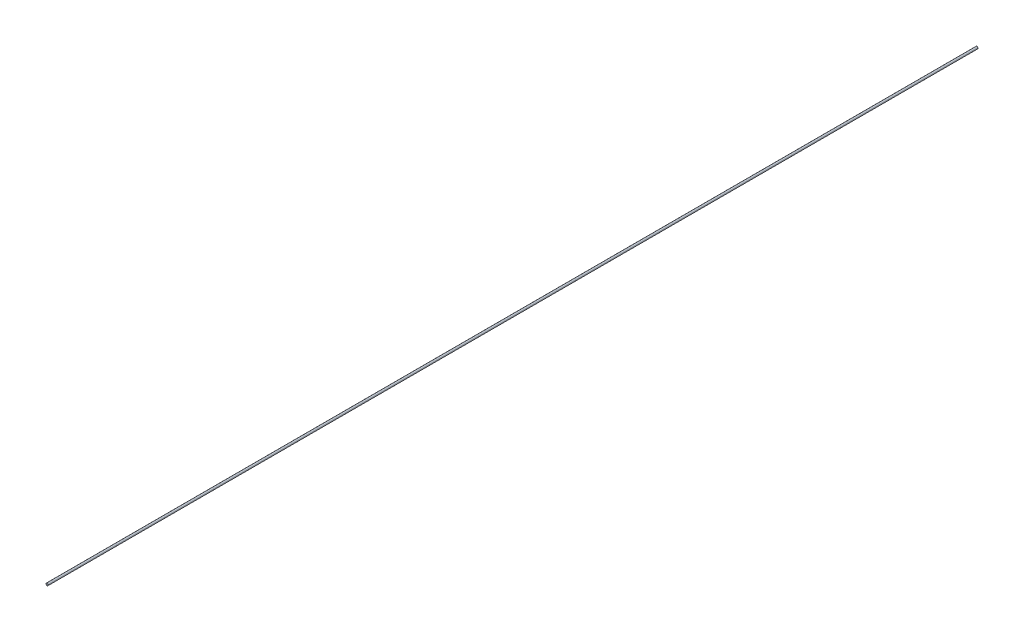
ISO-10303-21;
HEADER;
FILE_DESCRIPTION(('STEP AP214'),'2;1');
FILE_NAME('part.step','',(''),(''),'','','');
FILE_SCHEMA(('AUTOMOTIVE_DESIGN { 1 0 10303 214 1 1 1 1 }'));
ENDSEC;
DATA;
#1=APPLICATION_CONTEXT('core data for automotive mechanical design processes');
#2=APPLICATION_PROTOCOL_DEFINITION('international standard','automotive_design',2000,#1);
#3=PRODUCT_CONTEXT('',#1,'mechanical');
#4=PRODUCT('Part','Part','',(#3));
#5=PRODUCT_RELATED_PRODUCT_CATEGORY('part','',(#4));
#6=PRODUCT_DEFINITION_FORMATION('','',#4);
#7=PRODUCT_DEFINITION_CONTEXT('part definition',#1,'design');
#8=PRODUCT_DEFINITION('design','',#6,#7);
#9=PRODUCT_DEFINITION_SHAPE('','',#8);
#10=(LENGTH_UNIT() NAMED_UNIT(*) SI_UNIT(.MILLI.,.METRE.));
#11=(NAMED_UNIT(*) PLANE_ANGLE_UNIT() SI_UNIT($,.RADIAN.));
#12=(NAMED_UNIT(*) SI_UNIT($,.STERADIAN.) SOLID_ANGLE_UNIT());
#13=UNCERTAINTY_MEASURE_WITH_UNIT(LENGTH_MEASURE(1.E-05),#10,'distance_accuracy_value','');
#14=(GEOMETRIC_REPRESENTATION_CONTEXT(3) GLOBAL_UNCERTAINTY_ASSIGNED_CONTEXT((#13)) GLOBAL_UNIT_ASSIGNED_CONTEXT((#10,
#11,#12)) REPRESENTATION_CONTEXT('',''));
#15=CARTESIAN_POINT('',(0.,0.,0.));
#16=DIRECTION('',(0.,0.,1.));
#17=DIRECTION('',(1.,0.,0.));
#18=AXIS2_PLACEMENT_3D('',#15,#16,#17);
#19=CARTESIAN_POINT('',(0.,0.,304.8));
#20=DIRECTION('',(0.,0.,-1.));
#21=DIRECTION('',(-1.,0.,0.));
#22=AXIS2_PLACEMENT_3D('',#19,#20,#21);
#23=CYLINDRICAL_SURFACE('',#22,0.3556);
#24=CARTESIAN_POINT('',(0.,0.,304.8));
#25=DIRECTION('',(0.,0.,1.));
#26=DIRECTION('',(1.,0.,0.));
#27=AXIS2_PLACEMENT_3D('',#24,#25,#26);
#28=CIRCLE('',#27,0.3556);
#29=CARTESIAN_POINT('',(0.3556,0.,304.8));
#30=VERTEX_POINT('',#29);
#31=EDGE_CURVE('E10',#30,#30,#28,.T.);
#32=ORIENTED_EDGE('',*,*,#31,.F.);
#33=EDGE_LOOP('',(#32));
#34=FACE_BOUND('',#33,.T.);
#35=CARTESIAN_POINT('',(0.,0.,0.));
#36=DIRECTION('',(0.,0.,1.));
#37=DIRECTION('',(1.,0.,0.));
#38=AXIS2_PLACEMENT_3D('',#35,#36,#37);
#39=CIRCLE('',#38,0.3556);
#40=CARTESIAN_POINT('',(0.3556,0.,0.));
#41=VERTEX_POINT('',#40);
#42=EDGE_CURVE('E37',#41,#41,#39,.T.);
#43=ORIENTED_EDGE('',*,*,#42,.T.);
#44=EDGE_LOOP('',(#43));
#45=FACE_BOUND('',#44,.T.);
#46=ADVANCED_FACE('F34',(#34,#45),#23,.T.);
#47=CARTESIAN_POINT('',(0.,0.,304.8));
#48=DIRECTION('',(0.,0.,1.));
#49=DIRECTION('',(1.,0.,0.));
#50=AXIS2_PLACEMENT_3D('',#47,#48,#49);
#51=PLANE('',#50);
#52=ORIENTED_EDGE('',*,*,#31,.T.);
#53=EDGE_LOOP('',(#52));
#54=FACE_BOUND('',#53,.T.);
#55=ADVANCED_FACE('F49',(#54),#51,.T.);
#56=CARTESIAN_POINT('',(0.,0.,0.));
#57=DIRECTION('',(0.,0.,1.));
#58=DIRECTION('',(1.,0.,0.));
#59=AXIS2_PLACEMENT_3D('',#56,#57,#58);
#60=PLANE('',#59);
#61=ORIENTED_EDGE('',*,*,#42,.F.);
#62=EDGE_LOOP('',(#61));
#63=FACE_BOUND('',#62,.T.);
#64=ADVANCED_FACE('F47',(#63),#60,.F.);
#65=CLOSED_SHELL('',(#46,#55,#64));
#66=MANIFOLD_SOLID_BREP('B2',#65);
#67=ADVANCED_BREP_SHAPE_REPRESENTATION('',(#18,#66),#14);
#68=SHAPE_DEFINITION_REPRESENTATION(#9,#67);
ENDSEC;
END-ISO-10303-21;
